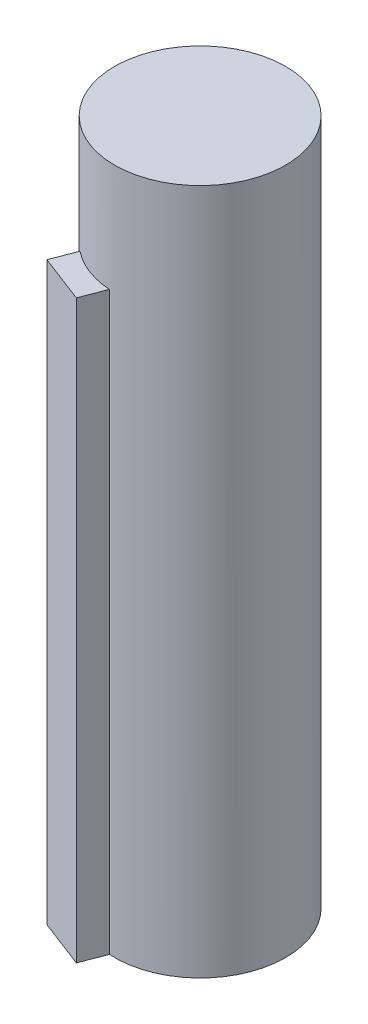
ISO-10303-21;
HEADER;
FILE_DESCRIPTION(('STEP AP214'),'2;1');
FILE_NAME('part.step','',(''),(''),'','','');
FILE_SCHEMA(('AUTOMOTIVE_DESIGN { 1 0 10303 214 1 1 1 1 }'));
ENDSEC;
DATA;
#1=APPLICATION_CONTEXT('core data for automotive mechanical design processes');
#2=APPLICATION_PROTOCOL_DEFINITION('international standard','automotive_design',2000,#1);
#3=PRODUCT_CONTEXT('',#1,'mechanical');
#4=PRODUCT('Part','Part','',(#3));
#5=PRODUCT_RELATED_PRODUCT_CATEGORY('part','',(#4));
#6=PRODUCT_DEFINITION_FORMATION('','',#4);
#7=PRODUCT_DEFINITION_CONTEXT('part definition',#1,'design');
#8=PRODUCT_DEFINITION('design','',#6,#7);
#9=PRODUCT_DEFINITION_SHAPE('','',#8);
#10=(LENGTH_UNIT() NAMED_UNIT(*) SI_UNIT(.MILLI.,.METRE.));
#11=(NAMED_UNIT(*) PLANE_ANGLE_UNIT() SI_UNIT($,.RADIAN.));
#12=(NAMED_UNIT(*) SI_UNIT($,.STERADIAN.) SOLID_ANGLE_UNIT());
#13=UNCERTAINTY_MEASURE_WITH_UNIT(LENGTH_MEASURE(1.E-05),#10,'distance_accuracy_value','');
#14=(GEOMETRIC_REPRESENTATION_CONTEXT(3) GLOBAL_UNCERTAINTY_ASSIGNED_CONTEXT((#13)) GLOBAL_UNIT_ASSIGNED_CONTEXT((#10,
#11,#12)) REPRESENTATION_CONTEXT('',''));
#15=CARTESIAN_POINT('',(0.,0.,0.));
#16=DIRECTION('',(0.,0.,1.));
#17=DIRECTION('',(1.,0.,0.));
#18=AXIS2_PLACEMENT_3D('',#15,#16,#17);
#19=CARTESIAN_POINT('',(0.,90.,0.));
#20=DIRECTION('',(0.,-1.,0.));
#21=DIRECTION('',(0.,0.,-1.));
#22=AXIS2_PLACEMENT_3D('',#19,#20,#21);
#23=CYLINDRICAL_SURFACE('',#22,13.368580060423);
#24=CARTESIAN_POINT('',(0.,0.,0.));
#25=DIRECTION('',(0.,1.,0.));
#26=DIRECTION('',(0.,0.,1.));
#27=AXIS2_PLACEMENT_3D('',#24,#25,#26);
#28=CIRCLE('',#27,13.368580060423);
#29=CARTESIAN_POINT('',(-0.832718515195952,0.,13.3426201589639));
#30=VERTEX_POINT('',#29);
#31=CARTESIAN_POINT('',(-8.30229602691756,0.,10.4781111615295));
#32=VERTEX_POINT('',#31);
#33=EDGE_CURVE('E97',#30,#32,#28,.T.);
#34=ORIENTED_EDGE('',*,*,#33,.T.);
#35=DIRECTION('',(0.,-1.,0.));
#36=VECTOR('',#35,1.);
#37=CARTESIAN_POINT('',(-8.30229602691756,90.,10.4781111615295));
#38=LINE('',#37,#36);
#39=CARTESIAN_POINT('',(-8.30229602691756,90.,10.4781111615295));
#40=VERTEX_POINT('',#39);
#41=EDGE_CURVE('E11',#40,#32,#38,.T.);
#42=ORIENTED_EDGE('',*,*,#41,.F.);
#43=CARTESIAN_POINT('',(0.,90.,0.));
#44=DIRECTION('',(0.,1.,0.));
#45=DIRECTION('',(0.,0.,1.));
#46=AXIS2_PLACEMENT_3D('',#43,#44,#45);
#47=CIRCLE('',#46,13.368580060423);
#48=CARTESIAN_POINT('',(-0.832718515195952,90.,13.3426201589639));
#49=VERTEX_POINT('',#48);
#50=EDGE_CURVE('E95',#40,#49,#47,.T.);
#51=ORIENTED_EDGE('',*,*,#50,.T.);
#52=DIRECTION('',(0.,-1.,0.));
#53=VECTOR('',#52,1.);
#54=CARTESIAN_POINT('',(-0.832718515195952,90.,13.3426201589639));
#55=LINE('',#54,#53);
#56=EDGE_CURVE('E116',#49,#30,#55,.T.);
#57=ORIENTED_EDGE('',*,*,#56,.T.);
#58=EDGE_LOOP('',(#34,#42,#51,#57));
#59=FACE_BOUND('',#58,.T.);
#60=CARTESIAN_POINT('',(0.,107.24,0.));
#61=DIRECTION('',(0.,1.,0.));
#62=DIRECTION('',(0.,0.,1.));
#63=AXIS2_PLACEMENT_3D('',#60,#61,#62);
#64=CIRCLE('',#63,13.368580060423);
#65=CARTESIAN_POINT('',(0.,107.24,13.368580060423));
#66=VERTEX_POINT('',#65);
#67=EDGE_CURVE('E45',#66,#66,#64,.T.);
#68=ORIENTED_EDGE('',*,*,#67,.F.);
#69=EDGE_LOOP('',(#68));
#70=FACE_BOUND('',#69,.T.);
#71=ADVANCED_FACE('F42',(#59,#70),#23,.T.);
#72=CARTESIAN_POINT('',(-9.73455052563476,90.,14.2128999173903));
#73=DIRECTION('',(0.933697188965202,0.,0.3580636246793));
#74=DIRECTION('',(0.3580636246793,0.,-0.933697188965203));
#75=AXIS2_PLACEMENT_3D('',#72,#73,#74);
#76=PLANE('',#75);
#77=DIRECTION('',(-0.3580636246793,0.,0.933697188965203));
#78=VECTOR('',#77,1.);
#79=CARTESIAN_POINT('',(-9.73455052563476,0.,14.2128999173903));
#80=LINE('',#79,#78);
#81=CARTESIAN_POINT('',(-9.73455052563476,0.,14.2128999173903));
#82=VERTEX_POINT('',#81);
#83=EDGE_CURVE('E109',#32,#82,#80,.T.);
#84=ORIENTED_EDGE('',*,*,#83,.T.);
#85=DIRECTION('',(0.,-1.,0.));
#86=VECTOR('',#85,1.);
#87=CARTESIAN_POINT('',(-9.73455052563476,90.,14.2128999173903));
#88=LINE('',#87,#86);
#89=CARTESIAN_POINT('',(-9.73455052563476,90.,14.2128999173903));
#90=VERTEX_POINT('',#89);
#91=EDGE_CURVE('E52',#90,#82,#88,.T.);
#92=ORIENTED_EDGE('',*,*,#91,.F.);
#93=DIRECTION('',(-0.3580636246793,0.,0.933697188965203));
#94=VECTOR('',#93,1.);
#95=CARTESIAN_POINT('',(-9.73455052563476,90.,14.2128999173903));
#96=LINE('',#95,#94);
#97=EDGE_CURVE('E87',#40,#90,#96,.T.);
#98=ORIENTED_EDGE('',*,*,#97,.F.);
#99=ORIENTED_EDGE('',*,*,#41,.T.);
#100=EDGE_LOOP('',(#84,#92,#98,#99));
#101=FACE_BOUND('',#100,.T.);
#102=ADVANCED_FACE('F99',(#101),#76,.F.);
#103=CARTESIAN_POINT('',(-2.26497301391314,90.,17.0774089148247));
#104=DIRECTION('',(0.3580636246793,0.,-0.933697188965203));
#105=DIRECTION('',(-0.933697188965203,0.,-0.3580636246793));
#106=AXIS2_PLACEMENT_3D('',#103,#104,#105);
#107=PLANE('',#106);
#108=DIRECTION('',(0.933697188965203,0.,0.3580636246793));
#109=VECTOR('',#108,1.);
#110=CARTESIAN_POINT('',(-2.26497301391314,0.,17.0774089148247));
#111=LINE('',#110,#109);
#112=CARTESIAN_POINT('',(-2.26497301391314,0.,17.0774089148247));
#113=VERTEX_POINT('',#112);
#114=EDGE_CURVE('E78',#82,#113,#111,.T.);
#115=ORIENTED_EDGE('',*,*,#114,.T.);
#116=DIRECTION('',(0.,-1.,0.));
#117=VECTOR('',#116,1.);
#118=CARTESIAN_POINT('',(-2.26497301391314,90.,17.0774089148247));
#119=LINE('',#118,#117);
#120=CARTESIAN_POINT('',(-2.26497301391314,90.,17.0774089148247));
#121=VERTEX_POINT('',#120);
#122=EDGE_CURVE('E126',#121,#113,#119,.T.);
#123=ORIENTED_EDGE('',*,*,#122,.F.);
#124=DIRECTION('',(0.933697188965203,0.,0.3580636246793));
#125=VECTOR('',#124,1.);
#126=CARTESIAN_POINT('',(-2.26497301391314,90.,17.0774089148247));
#127=LINE('',#126,#125);
#128=EDGE_CURVE('E102',#90,#121,#127,.T.);
#129=ORIENTED_EDGE('',*,*,#128,.F.);
#130=ORIENTED_EDGE('',*,*,#91,.T.);
#131=EDGE_LOOP('',(#115,#123,#129,#130));
#132=FACE_BOUND('',#131,.T.);
#133=ADVANCED_FACE('F130',(#132),#107,.F.);
#134=CARTESIAN_POINT('',(-0.832718515195952,90.,13.3426201589639));
#135=DIRECTION('',(-0.933697188965203,0.,-0.3580636246793));
#136=DIRECTION('',(-0.3580636246793,0.,0.933697188965203));
#137=AXIS2_PLACEMENT_3D('',#134,#135,#136);
#138=PLANE('',#137);
#139=DIRECTION('',(0.3580636246793,0.,-0.933697188965203));
#140=VECTOR('',#139,1.);
#141=CARTESIAN_POINT('',(-0.832718515195952,0.,13.3426201589639));
#142=LINE('',#141,#140);
#143=EDGE_CURVE('E83',#113,#30,#142,.T.);
#144=ORIENTED_EDGE('',*,*,#143,.T.);
#145=ORIENTED_EDGE('',*,*,#56,.F.);
#146=DIRECTION('',(0.3580636246793,0.,-0.933697188965203));
#147=VECTOR('',#146,1.);
#148=CARTESIAN_POINT('',(-0.832718515195952,90.,13.3426201589639));
#149=LINE('',#148,#147);
#150=EDGE_CURVE('E60',#121,#49,#149,.T.);
#151=ORIENTED_EDGE('',*,*,#150,.F.);
#152=ORIENTED_EDGE('',*,*,#122,.T.);
#153=EDGE_LOOP('',(#144,#145,#151,#152));
#154=FACE_BOUND('',#153,.T.);
#155=ADVANCED_FACE('F143',(#154),#138,.F.);
#156=CARTESIAN_POINT('',(0.,90.,0.));
#157=DIRECTION('',(0.,1.,0.));
#158=DIRECTION('',(0.,0.,1.));
#159=AXIS2_PLACEMENT_3D('',#156,#157,#158);
#160=PLANE('',#159);
#161=ORIENTED_EDGE('',*,*,#50,.F.);
#162=ORIENTED_EDGE('',*,*,#97,.T.);
#163=ORIENTED_EDGE('',*,*,#128,.T.);
#164=ORIENTED_EDGE('',*,*,#150,.T.);
#165=EDGE_LOOP('',(#161,#162,#163,#164));
#166=FACE_BOUND('',#165,.T.);
#167=ADVANCED_FACE('F104',(#166),#160,.T.);
#168=CARTESIAN_POINT('',(0.,0.,0.));
#169=DIRECTION('',(0.,1.,0.));
#170=DIRECTION('',(0.,0.,1.));
#171=AXIS2_PLACEMENT_3D('',#168,#169,#170);
#172=PLANE('',#171);
#173=ORIENTED_EDGE('',*,*,#33,.F.);
#174=ORIENTED_EDGE('',*,*,#143,.F.);
#175=ORIENTED_EDGE('',*,*,#114,.F.);
#176=ORIENTED_EDGE('',*,*,#83,.F.);
#177=EDGE_LOOP('',(#173,#174,#175,#176));
#178=FACE_BOUND('',#177,.T.);
#179=ADVANCED_FACE('F132',(#178),#172,.F.);
#180=CARTESIAN_POINT('',(0.,107.24,0.));
#181=DIRECTION('',(0.,1.,0.));
#182=DIRECTION('',(0.,0.,1.));
#183=AXIS2_PLACEMENT_3D('',#180,#181,#182);
#184=PLANE('',#183);
#185=ORIENTED_EDGE('',*,*,#67,.T.);
#186=EDGE_LOOP('',(#185));
#187=FACE_BOUND('',#186,.T.);
#188=ADVANCED_FACE('F134',(#187),#184,.T.);
#189=CLOSED_SHELL('',(#71,#102,#133,#155,#167,#179,#188));
#190=MANIFOLD_SOLID_BREP('B2',#189);
#191=ADVANCED_BREP_SHAPE_REPRESENTATION('',(#18,#190),#14);
#192=SHAPE_DEFINITION_REPRESENTATION(#9,#191);
ENDSEC;
END-ISO-10303-21;
